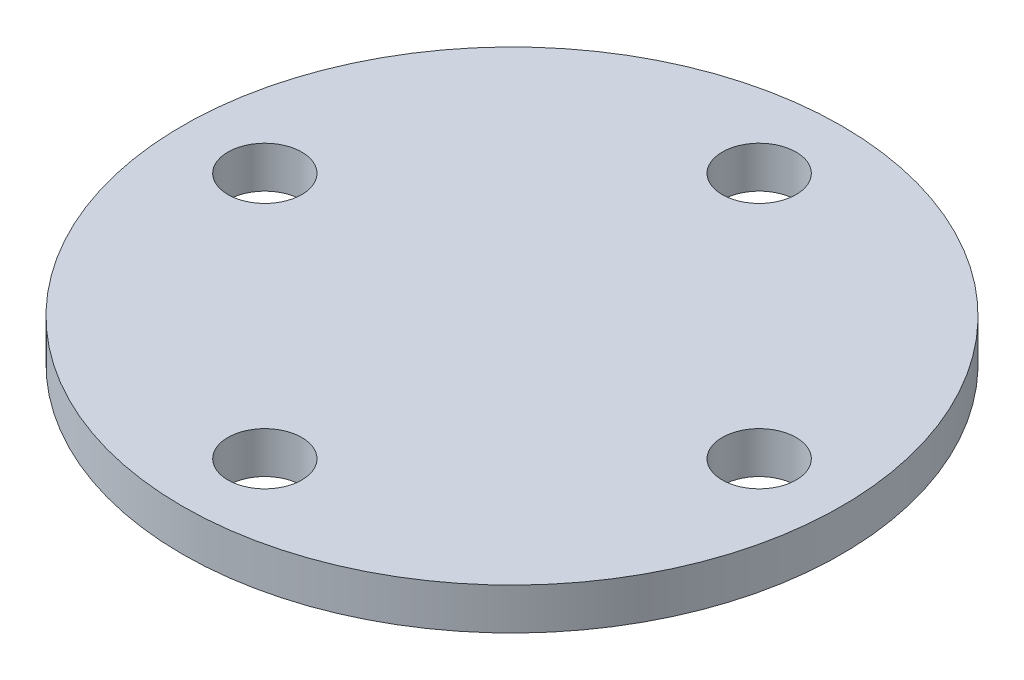
ISO-10303-21;
HEADER;
FILE_DESCRIPTION(('STEP AP214'),'2;1');
FILE_NAME('part.step','',(''),(''),'','','');
FILE_SCHEMA(('AUTOMOTIVE_DESIGN { 1 0 10303 214 1 1 1 1 }'));
ENDSEC;
DATA;
#1=APPLICATION_CONTEXT('core data for automotive mechanical design processes');
#2=APPLICATION_PROTOCOL_DEFINITION('international standard','automotive_design',2000,#1);
#3=PRODUCT_CONTEXT('',#1,'mechanical');
#4=PRODUCT('Part','Part','',(#3));
#5=PRODUCT_RELATED_PRODUCT_CATEGORY('part','',(#4));
#6=PRODUCT_DEFINITION_FORMATION('','',#4);
#7=PRODUCT_DEFINITION_CONTEXT('part definition',#1,'design');
#8=PRODUCT_DEFINITION('design','',#6,#7);
#9=PRODUCT_DEFINITION_SHAPE('','',#8);
#10=(LENGTH_UNIT() NAMED_UNIT(*) SI_UNIT(.MILLI.,.METRE.));
#11=(NAMED_UNIT(*) PLANE_ANGLE_UNIT() SI_UNIT($,.RADIAN.));
#12=(NAMED_UNIT(*) SI_UNIT($,.STERADIAN.) SOLID_ANGLE_UNIT());
#13=UNCERTAINTY_MEASURE_WITH_UNIT(LENGTH_MEASURE(1.E-05),#10,'distance_accuracy_value','');
#14=(GEOMETRIC_REPRESENTATION_CONTEXT(3) GLOBAL_UNCERTAINTY_ASSIGNED_CONTEXT((#13)) GLOBAL_UNIT_ASSIGNED_CONTEXT((#10,
#11,#12)) REPRESENTATION_CONTEXT('',''));
#15=CARTESIAN_POINT('',(0.,0.,0.));
#16=DIRECTION('',(0.,0.,1.));
#17=DIRECTION('',(1.,0.,0.));
#18=AXIS2_PLACEMENT_3D('',#15,#16,#17);
#19=CARTESIAN_POINT('',(0.,1.6002,0.));
#20=DIRECTION('',(0.,-1.,0.));
#21=DIRECTION('',(0.,0.,-1.));
#22=AXIS2_PLACEMENT_3D('',#19,#20,#21);
#23=CYLINDRICAL_SURFACE('',#22,12.7);
#24=CARTESIAN_POINT('',(0.,1.6002,0.));
#25=DIRECTION('',(0.,1.,0.));
#26=DIRECTION('',(0.,0.,1.));
#27=AXIS2_PLACEMENT_3D('',#24,#25,#26);
#28=CIRCLE('',#27,12.7);
#29=CARTESIAN_POINT('',(0.,1.6002,12.7));
#30=VERTEX_POINT('',#29);
#31=EDGE_CURVE('E10',#30,#30,#28,.T.);
#32=ORIENTED_EDGE('',*,*,#31,.F.);
#33=EDGE_LOOP('',(#32));
#34=FACE_BOUND('',#33,.T.);
#35=CARTESIAN_POINT('',(0.,0.,0.));
#36=DIRECTION('',(0.,1.,0.));
#37=DIRECTION('',(0.,0.,1.));
#38=AXIS2_PLACEMENT_3D('',#35,#36,#37);
#39=CIRCLE('',#38,12.7);
#40=CARTESIAN_POINT('',(0.,0.,12.7));
#41=VERTEX_POINT('',#40);
#42=EDGE_CURVE('E34',#41,#41,#39,.T.);
#43=ORIENTED_EDGE('',*,*,#42,.T.);
#44=EDGE_LOOP('',(#43));
#45=FACE_BOUND('',#44,.T.);
#46=ADVANCED_FACE('F31',(#34,#45),#23,.T.);
#47=CARTESIAN_POINT('',(0.,1.6002,0.));
#48=DIRECTION('',(0.,1.,0.));
#49=DIRECTION('',(0.,0.,1.));
#50=AXIS2_PLACEMENT_3D('',#47,#48,#49);
#51=PLANE('',#50);
#52=CARTESIAN_POINT('',(0.,1.6002,9.525));
#53=DIRECTION('',(0.,1.,0.));
#54=DIRECTION('',(1.,0.,0.));
#55=AXIS2_PLACEMENT_3D('',#52,#53,#54);
#56=CIRCLE('',#55,1.4224);
#57=CARTESIAN_POINT('',(1.4223999999999,1.6002,9.52500000000002));
#58=VERTEX_POINT('',#57);
#59=EDGE_CURVE('E61',#58,#58,#56,.T.);
#60=ORIENTED_EDGE('',*,*,#59,.F.);
#61=EDGE_LOOP('',(#60));
#62=FACE_BOUND('',#61,.T.);
#63=CARTESIAN_POINT('',(9.525,1.6002,0.));
#64=DIRECTION('',(0.,1.,0.));
#65=DIRECTION('',(0.,0.,-1.));
#66=AXIS2_PLACEMENT_3D('',#63,#64,#65);
#67=CIRCLE('',#66,1.4224);
#68=CARTESIAN_POINT('',(9.525,1.6002,-1.4224));
#69=VERTEX_POINT('',#68);
#70=EDGE_CURVE('E55',#69,#69,#67,.T.);
#71=ORIENTED_EDGE('',*,*,#70,.F.);
#72=EDGE_LOOP('',(#71));
#73=FACE_BOUND('',#72,.T.);
#74=CARTESIAN_POINT('',(0.,1.6002,-9.525));
#75=DIRECTION('',(0.,1.,0.));
#76=DIRECTION('',(-1.,0.,0.));
#77=AXIS2_PLACEMENT_3D('',#74,#75,#76);
#78=CIRCLE('',#77,1.4224);
#79=CARTESIAN_POINT('',(-1.42239999999997,1.6002,-9.52500000000001));
#80=VERTEX_POINT('',#79);
#81=EDGE_CURVE('E49',#80,#80,#78,.T.);
#82=ORIENTED_EDGE('',*,*,#81,.F.);
#83=EDGE_LOOP('',(#82));
#84=FACE_BOUND('',#83,.T.);
#85=CARTESIAN_POINT('',(-9.525,1.6002,0.));
#86=DIRECTION('',(0.,1.,0.));
#87=DIRECTION('',(0.,0.,1.));
#88=AXIS2_PLACEMENT_3D('',#85,#86,#87);
#89=CIRCLE('',#88,1.4224);
#90=CARTESIAN_POINT('',(-9.525,1.6002,1.4224));
#91=VERTEX_POINT('',#90);
#92=EDGE_CURVE('E43',#91,#91,#89,.T.);
#93=ORIENTED_EDGE('',*,*,#92,.F.);
#94=EDGE_LOOP('',(#93));
#95=FACE_BOUND('',#94,.T.);
#96=ORIENTED_EDGE('',*,*,#31,.T.);
#97=EDGE_LOOP('',(#96));
#98=FACE_BOUND('',#97,.T.);
#99=ADVANCED_FACE('F77',(#62,#73,#84,#95,#98),#51,.T.);
#100=CARTESIAN_POINT('',(0.,0.,0.));
#101=DIRECTION('',(0.,1.,0.));
#102=DIRECTION('',(0.,0.,1.));
#103=AXIS2_PLACEMENT_3D('',#100,#101,#102);
#104=PLANE('',#103);
#105=CARTESIAN_POINT('',(0.,0.,9.525));
#106=DIRECTION('',(0.,1.,0.));
#107=DIRECTION('',(1.,0.,0.));
#108=AXIS2_PLACEMENT_3D('',#105,#106,#107);
#109=CIRCLE('',#108,1.4224);
#110=CARTESIAN_POINT('',(1.4223999999999,0.,9.52500000000002));
#111=VERTEX_POINT('',#110);
#112=EDGE_CURVE('E58',#111,#111,#109,.T.);
#113=ORIENTED_EDGE('',*,*,#112,.T.);
#114=EDGE_LOOP('',(#113));
#115=FACE_BOUND('',#114,.T.);
#116=CARTESIAN_POINT('',(9.525,0.,0.));
#117=DIRECTION('',(0.,1.,0.));
#118=DIRECTION('',(0.,0.,-1.));
#119=AXIS2_PLACEMENT_3D('',#116,#117,#118);
#120=CIRCLE('',#119,1.4224);
#121=CARTESIAN_POINT('',(9.525,0.,-1.4224));
#122=VERTEX_POINT('',#121);
#123=EDGE_CURVE('E52',#122,#122,#120,.T.);
#124=ORIENTED_EDGE('',*,*,#123,.T.);
#125=EDGE_LOOP('',(#124));
#126=FACE_BOUND('',#125,.T.);
#127=CARTESIAN_POINT('',(0.,0.,-9.525));
#128=DIRECTION('',(0.,1.,0.));
#129=DIRECTION('',(-1.,0.,0.));
#130=AXIS2_PLACEMENT_3D('',#127,#128,#129);
#131=CIRCLE('',#130,1.4224);
#132=CARTESIAN_POINT('',(-1.42239999999997,0.,-9.52500000000001));
#133=VERTEX_POINT('',#132);
#134=EDGE_CURVE('E46',#133,#133,#131,.T.);
#135=ORIENTED_EDGE('',*,*,#134,.T.);
#136=EDGE_LOOP('',(#135));
#137=FACE_BOUND('',#136,.T.);
#138=CARTESIAN_POINT('',(-9.525,0.,0.));
#139=DIRECTION('',(0.,1.,0.));
#140=DIRECTION('',(0.,0.,1.));
#141=AXIS2_PLACEMENT_3D('',#138,#139,#140);
#142=CIRCLE('',#141,1.4224);
#143=CARTESIAN_POINT('',(-9.525,0.,1.4224));
#144=VERTEX_POINT('',#143);
#145=EDGE_CURVE('E41',#144,#144,#142,.T.);
#146=ORIENTED_EDGE('',*,*,#145,.T.);
#147=EDGE_LOOP('',(#146));
#148=FACE_BOUND('',#147,.T.);
#149=ORIENTED_EDGE('',*,*,#42,.F.);
#150=EDGE_LOOP('',(#149));
#151=FACE_BOUND('',#150,.T.);
#152=ADVANCED_FACE('F67',(#115,#126,#137,#148,#151),#104,.F.);
#153=CARTESIAN_POINT('',(-9.525,0.,0.));
#154=DIRECTION('',(0.,1.,0.));
#155=DIRECTION('',(0.,0.,1.));
#156=AXIS2_PLACEMENT_3D('',#153,#154,#155);
#157=CYLINDRICAL_SURFACE('',#156,1.4224);
#158=ORIENTED_EDGE('',*,*,#145,.F.);
#159=EDGE_LOOP('',(#158));
#160=FACE_BOUND('',#159,.T.);
#161=ORIENTED_EDGE('',*,*,#92,.T.);
#162=EDGE_LOOP('',(#161));
#163=FACE_BOUND('',#162,.T.);
#164=ADVANCED_FACE('F87',(#160,#163),#157,.F.);
#165=CARTESIAN_POINT('',(0.,0.,-9.525));
#166=DIRECTION('',(0.,1.,0.));
#167=DIRECTION('',(0.,0.,1.));
#168=AXIS2_PLACEMENT_3D('',#165,#166,#167);
#169=CYLINDRICAL_SURFACE('',#168,1.4224);
#170=ORIENTED_EDGE('',*,*,#134,.F.);
#171=EDGE_LOOP('',(#170));
#172=FACE_BOUND('',#171,.T.);
#173=ORIENTED_EDGE('',*,*,#81,.T.);
#174=EDGE_LOOP('',(#173));
#175=FACE_BOUND('',#174,.T.);
#176=ADVANCED_FACE('F89',(#172,#175),#169,.F.);
#177=CARTESIAN_POINT('',(9.525,0.,0.));
#178=DIRECTION('',(0.,1.,0.));
#179=DIRECTION('',(0.,0.,1.));
#180=AXIS2_PLACEMENT_3D('',#177,#178,#179);
#181=CYLINDRICAL_SURFACE('',#180,1.4224);
#182=ORIENTED_EDGE('',*,*,#123,.F.);
#183=EDGE_LOOP('',(#182));
#184=FACE_BOUND('',#183,.T.);
#185=ORIENTED_EDGE('',*,*,#70,.T.);
#186=EDGE_LOOP('',(#185));
#187=FACE_BOUND('',#186,.T.);
#188=ADVANCED_FACE('F73',(#184,#187),#181,.F.);
#189=CARTESIAN_POINT('',(0.,0.,9.525));
#190=DIRECTION('',(0.,1.,0.));
#191=DIRECTION('',(0.,0.,1.));
#192=AXIS2_PLACEMENT_3D('',#189,#190,#191);
#193=CYLINDRICAL_SURFACE('',#192,1.4224);
#194=ORIENTED_EDGE('',*,*,#112,.F.);
#195=EDGE_LOOP('',(#194));
#196=FACE_BOUND('',#195,.T.);
#197=ORIENTED_EDGE('',*,*,#59,.T.);
#198=EDGE_LOOP('',(#197));
#199=FACE_BOUND('',#198,.T.);
#200=ADVANCED_FACE('F70',(#196,#199),#193,.F.);
#201=CLOSED_SHELL('',(#46,#99,#152,#164,#176,#188,#200));
#202=MANIFOLD_SOLID_BREP('B2',#201);
#203=ADVANCED_BREP_SHAPE_REPRESENTATION('',(#18,#202),#14);
#204=SHAPE_DEFINITION_REPRESENTATION(#9,#203);
ENDSEC;
END-ISO-10303-21;
